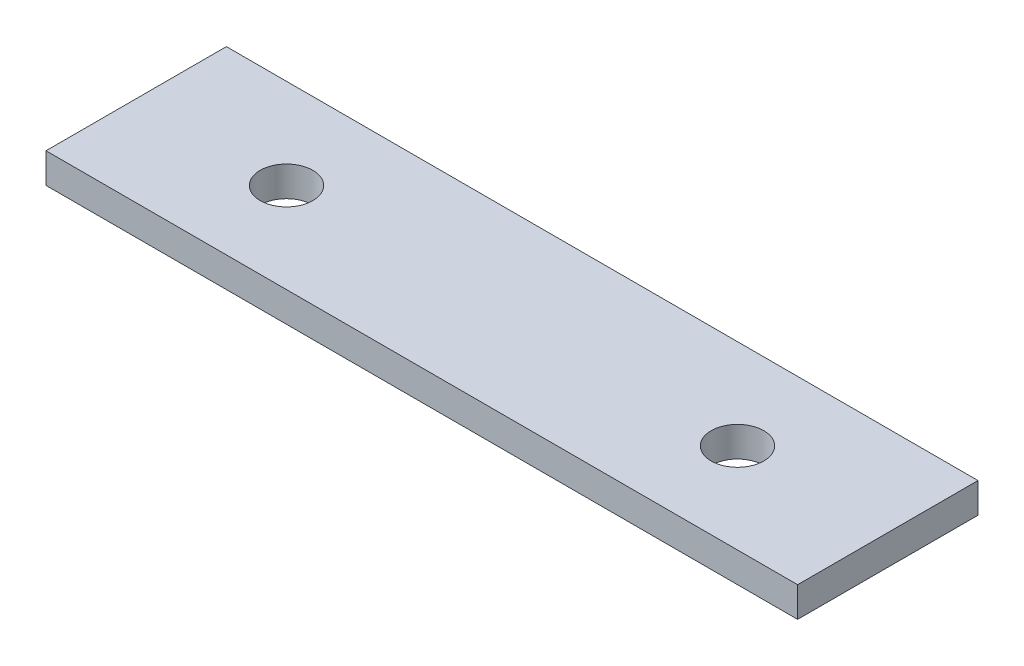
ISO-10303-21;
HEADER;
FILE_DESCRIPTION(('STEP AP214'),'2;1');
FILE_NAME('part.step','',(''),(''),'','','');
FILE_SCHEMA(('AUTOMOTIVE_DESIGN { 1 0 10303 214 1 1 1 1 }'));
ENDSEC;
DATA;
#1=APPLICATION_CONTEXT('core data for automotive mechanical design processes');
#2=APPLICATION_PROTOCOL_DEFINITION('international standard','automotive_design',2000,#1);
#3=PRODUCT_CONTEXT('',#1,'mechanical');
#4=PRODUCT('Part','Part','',(#3));
#5=PRODUCT_RELATED_PRODUCT_CATEGORY('part','',(#4));
#6=PRODUCT_DEFINITION_FORMATION('','',#4);
#7=PRODUCT_DEFINITION_CONTEXT('part definition',#1,'design');
#8=PRODUCT_DEFINITION('design','',#6,#7);
#9=PRODUCT_DEFINITION_SHAPE('','',#8);
#10=(LENGTH_UNIT() NAMED_UNIT(*) SI_UNIT(.MILLI.,.METRE.));
#11=(NAMED_UNIT(*) PLANE_ANGLE_UNIT() SI_UNIT($,.RADIAN.));
#12=(NAMED_UNIT(*) SI_UNIT($,.STERADIAN.) SOLID_ANGLE_UNIT());
#13=UNCERTAINTY_MEASURE_WITH_UNIT(LENGTH_MEASURE(1.E-05),#10,'distance_accuracy_value','');
#14=(GEOMETRIC_REPRESENTATION_CONTEXT(3) GLOBAL_UNCERTAINTY_ASSIGNED_CONTEXT((#13)) GLOBAL_UNIT_ASSIGNED_CONTEXT((#10,
#11,#12)) REPRESENTATION_CONTEXT('',''));
#15=CARTESIAN_POINT('',(0.,0.,0.));
#16=DIRECTION('',(0.,0.,1.));
#17=DIRECTION('',(1.,0.,0.));
#18=AXIS2_PLACEMENT_3D('',#15,#16,#17);
#19=CARTESIAN_POINT('',(0.,2.,0.));
#20=DIRECTION('',(0.,-1.,0.));
#21=DIRECTION('',(0.,0.,-1.));
#22=AXIS2_PLACEMENT_3D('',#19,#20,#21);
#23=PLANE('',#22);
#24=DIRECTION('',(0.,0.,1.));
#25=VECTOR('',#24,1.);
#26=CARTESIAN_POINT('',(-25.,2.,-6.));
#27=LINE('',#26,#25);
#28=CARTESIAN_POINT('',(-25.,2.,-6.));
#29=VERTEX_POINT('',#28);
#30=CARTESIAN_POINT('',(-25.,2.,6.));
#31=VERTEX_POINT('',#30);
#32=EDGE_CURVE('E89',#29,#31,#27,.T.);
#33=ORIENTED_EDGE('',*,*,#32,.T.);
#34=DIRECTION('',(1.,0.,0.));
#35=VECTOR('',#34,1.);
#36=CARTESIAN_POINT('',(25.,2.,6.));
#37=LINE('',#36,#35);
#38=CARTESIAN_POINT('',(25.,2.,6.));
#39=VERTEX_POINT('',#38);
#40=EDGE_CURVE('E84',#31,#39,#37,.T.);
#41=ORIENTED_EDGE('',*,*,#40,.T.);
#42=DIRECTION('',(0.,0.,-1.));
#43=VECTOR('',#42,1.);
#44=CARTESIAN_POINT('',(25.,2.,-6.));
#45=LINE('',#44,#43);
#46=CARTESIAN_POINT('',(25.,2.,-6.));
#47=VERTEX_POINT('',#46);
#48=EDGE_CURVE('E87',#39,#47,#45,.T.);
#49=ORIENTED_EDGE('',*,*,#48,.T.);
#50=DIRECTION('',(-1.,0.,0.));
#51=VECTOR('',#50,1.);
#52=CARTESIAN_POINT('',(25.,2.,-6.));
#53=LINE('',#52,#51);
#54=EDGE_CURVE('E54',#47,#29,#53,.T.);
#55=ORIENTED_EDGE('',*,*,#54,.T.);
#56=EDGE_LOOP('',(#33,#41,#49,#55));
#57=FACE_BOUND('',#56,.T.);
#58=CARTESIAN_POINT('',(-15.,2.,0.));
#59=DIRECTION('',(0.,1.,0.));
#60=DIRECTION('',(0.,0.,1.));
#61=AXIS2_PLACEMENT_3D('',#58,#59,#60);
#62=CIRCLE('',#61,1.75);
#63=CARTESIAN_POINT('',(-15.,2.,1.75));
#64=VERTEX_POINT('',#63);
#65=EDGE_CURVE('E104',#64,#64,#62,.T.);
#66=ORIENTED_EDGE('',*,*,#65,.F.);
#67=EDGE_LOOP('',(#66));
#68=FACE_BOUND('',#67,.T.);
#69=CARTESIAN_POINT('',(15.,2.,0.));
#70=DIRECTION('',(0.,1.,0.));
#71=DIRECTION('',(0.,0.,1.));
#72=AXIS2_PLACEMENT_3D('',#69,#70,#71);
#73=CIRCLE('',#72,1.75);
#74=CARTESIAN_POINT('',(15.,2.,1.75));
#75=VERTEX_POINT('',#74);
#76=EDGE_CURVE('E119',#75,#75,#73,.T.);
#77=ORIENTED_EDGE('',*,*,#76,.F.);
#78=EDGE_LOOP('',(#77));
#79=FACE_BOUND('',#78,.T.);
#80=ADVANCED_FACE('F37',(#57,#68,#79),#23,.F.);
#81=CARTESIAN_POINT('',(0.,0.,0.));
#82=DIRECTION('',(0.,-1.,0.));
#83=DIRECTION('',(0.,0.,-1.));
#84=AXIS2_PLACEMENT_3D('',#81,#82,#83);
#85=PLANE('',#84);
#86=CARTESIAN_POINT('',(-15.,0.,0.));
#87=DIRECTION('',(0.,1.,0.));
#88=DIRECTION('',(0.,0.,1.));
#89=AXIS2_PLACEMENT_3D('',#86,#87,#88);
#90=CIRCLE('',#89,1.75);
#91=CARTESIAN_POINT('',(-15.,0.,1.75));
#92=VERTEX_POINT('',#91);
#93=EDGE_CURVE('E116',#92,#92,#90,.T.);
#94=ORIENTED_EDGE('',*,*,#93,.T.);
#95=EDGE_LOOP('',(#94));
#96=FACE_BOUND('',#95,.T.);
#97=DIRECTION('',(0.,0.,1.));
#98=VECTOR('',#97,1.);
#99=CARTESIAN_POINT('',(-25.,0.,-6.));
#100=LINE('',#99,#98);
#101=CARTESIAN_POINT('',(-25.,0.,-6.));
#102=VERTEX_POINT('',#101);
#103=CARTESIAN_POINT('',(-25.,0.,6.));
#104=VERTEX_POINT('',#103);
#105=EDGE_CURVE('E101',#102,#104,#100,.T.);
#106=ORIENTED_EDGE('',*,*,#105,.F.);
#107=DIRECTION('',(-1.,0.,0.));
#108=VECTOR('',#107,1.);
#109=CARTESIAN_POINT('',(25.,0.,-6.));
#110=LINE('',#109,#108);
#111=CARTESIAN_POINT('',(25.,0.,-6.));
#112=VERTEX_POINT('',#111);
#113=EDGE_CURVE('E77',#112,#102,#110,.T.);
#114=ORIENTED_EDGE('',*,*,#113,.F.);
#115=DIRECTION('',(0.,0.,-1.));
#116=VECTOR('',#115,1.);
#117=CARTESIAN_POINT('',(25.,0.,-6.));
#118=LINE('',#117,#116);
#119=CARTESIAN_POINT('',(25.,0.,6.));
#120=VERTEX_POINT('',#119);
#121=EDGE_CURVE('E71',#120,#112,#118,.T.);
#122=ORIENTED_EDGE('',*,*,#121,.F.);
#123=DIRECTION('',(1.,0.,0.));
#124=VECTOR('',#123,1.);
#125=CARTESIAN_POINT('',(25.,0.,6.));
#126=LINE('',#125,#124);
#127=EDGE_CURVE('E93',#104,#120,#126,.T.);
#128=ORIENTED_EDGE('',*,*,#127,.F.);
#129=EDGE_LOOP('',(#106,#114,#122,#128));
#130=FACE_BOUND('',#129,.T.);
#131=CARTESIAN_POINT('',(15.,0.,0.));
#132=DIRECTION('',(0.,1.,0.));
#133=DIRECTION('',(0.,0.,1.));
#134=AXIS2_PLACEMENT_3D('',#131,#132,#133);
#135=CIRCLE('',#134,1.75);
#136=CARTESIAN_POINT('',(15.,0.,1.75));
#137=VERTEX_POINT('',#136);
#138=EDGE_CURVE('E122',#137,#137,#135,.T.);
#139=ORIENTED_EDGE('',*,*,#138,.T.);
#140=EDGE_LOOP('',(#139));
#141=FACE_BOUND('',#140,.T.);
#142=ADVANCED_FACE('F112',(#96,#130,#141),#85,.T.);
#143=CARTESIAN_POINT('',(-25.,2.,-6.));
#144=DIRECTION('',(1.,0.,0.));
#145=DIRECTION('',(0.,0.,-1.));
#146=AXIS2_PLACEMENT_3D('',#143,#144,#145);
#147=PLANE('',#146);
#148=ORIENTED_EDGE('',*,*,#105,.T.);
#149=DIRECTION('',(0.,-1.,0.));
#150=VECTOR('',#149,1.);
#151=CARTESIAN_POINT('',(-25.,2.,6.));
#152=LINE('',#151,#150);
#153=EDGE_CURVE('E11',#31,#104,#152,.T.);
#154=ORIENTED_EDGE('',*,*,#153,.F.);
#155=ORIENTED_EDGE('',*,*,#32,.F.);
#156=DIRECTION('',(0.,-1.,0.));
#157=VECTOR('',#156,1.);
#158=CARTESIAN_POINT('',(-25.,2.,-6.));
#159=LINE('',#158,#157);
#160=EDGE_CURVE('E97',#29,#102,#159,.T.);
#161=ORIENTED_EDGE('',*,*,#160,.T.);
#162=EDGE_LOOP('',(#148,#154,#155,#161));
#163=FACE_BOUND('',#162,.T.);
#164=ADVANCED_FACE('F39',(#163),#147,.F.);
#165=CARTESIAN_POINT('',(25.,2.,6.));
#166=DIRECTION('',(0.,0.,-1.));
#167=DIRECTION('',(-1.,0.,0.));
#168=AXIS2_PLACEMENT_3D('',#165,#166,#167);
#169=PLANE('',#168);
#170=ORIENTED_EDGE('',*,*,#127,.T.);
#171=DIRECTION('',(0.,-1.,0.));
#172=VECTOR('',#171,1.);
#173=CARTESIAN_POINT('',(25.,2.,6.));
#174=LINE('',#173,#172);
#175=EDGE_CURVE('E46',#39,#120,#174,.T.);
#176=ORIENTED_EDGE('',*,*,#175,.F.);
#177=ORIENTED_EDGE('',*,*,#40,.F.);
#178=ORIENTED_EDGE('',*,*,#153,.T.);
#179=EDGE_LOOP('',(#170,#176,#177,#178));
#180=FACE_BOUND('',#179,.T.);
#181=ADVANCED_FACE('F92',(#180),#169,.F.);
#182=CARTESIAN_POINT('',(25.,2.,-6.));
#183=DIRECTION('',(-1.,0.,0.));
#184=DIRECTION('',(0.,0.,1.));
#185=AXIS2_PLACEMENT_3D('',#182,#183,#184);
#186=PLANE('',#185);
#187=ORIENTED_EDGE('',*,*,#121,.T.);
#188=DIRECTION('',(0.,-1.,0.));
#189=VECTOR('',#188,1.);
#190=CARTESIAN_POINT('',(25.,2.,-6.));
#191=LINE('',#190,#189);
#192=EDGE_CURVE('E94',#47,#112,#191,.T.);
#193=ORIENTED_EDGE('',*,*,#192,.F.);
#194=ORIENTED_EDGE('',*,*,#48,.F.);
#195=ORIENTED_EDGE('',*,*,#175,.T.);
#196=EDGE_LOOP('',(#187,#193,#194,#195));
#197=FACE_BOUND('',#196,.T.);
#198=ADVANCED_FACE('F95',(#197),#186,.F.);
#199=CARTESIAN_POINT('',(25.,2.,-6.));
#200=DIRECTION('',(0.,0.,1.));
#201=DIRECTION('',(1.,0.,0.));
#202=AXIS2_PLACEMENT_3D('',#199,#200,#201);
#203=PLANE('',#202);
#204=ORIENTED_EDGE('',*,*,#113,.T.);
#205=ORIENTED_EDGE('',*,*,#160,.F.);
#206=ORIENTED_EDGE('',*,*,#54,.F.);
#207=ORIENTED_EDGE('',*,*,#192,.T.);
#208=EDGE_LOOP('',(#204,#205,#206,#207));
#209=FACE_BOUND('',#208,.T.);
#210=ADVANCED_FACE('F109',(#209),#203,.F.);
#211=CARTESIAN_POINT('',(-15.,2.,0.));
#212=DIRECTION('',(0.,-1.,0.));
#213=DIRECTION('',(0.,0.,-1.));
#214=AXIS2_PLACEMENT_3D('',#211,#212,#213);
#215=CYLINDRICAL_SURFACE('',#214,1.75);
#216=ORIENTED_EDGE('',*,*,#65,.T.);
#217=EDGE_LOOP('',(#216));
#218=FACE_BOUND('',#217,.T.);
#219=ORIENTED_EDGE('',*,*,#93,.F.);
#220=EDGE_LOOP('',(#219));
#221=FACE_BOUND('',#220,.T.);
#222=ADVANCED_FACE('F139',(#218,#221),#215,.F.);
#223=CARTESIAN_POINT('',(15.,2.,0.));
#224=DIRECTION('',(0.,-1.,0.));
#225=DIRECTION('',(0.,0.,-1.));
#226=AXIS2_PLACEMENT_3D('',#223,#224,#225);
#227=CYLINDRICAL_SURFACE('',#226,1.75);
#228=ORIENTED_EDGE('',*,*,#76,.T.);
#229=EDGE_LOOP('',(#228));
#230=FACE_BOUND('',#229,.T.);
#231=ORIENTED_EDGE('',*,*,#138,.F.);
#232=EDGE_LOOP('',(#231));
#233=FACE_BOUND('',#232,.T.);
#234=ADVANCED_FACE('F128',(#230,#233),#227,.F.);
#235=CLOSED_SHELL('',(#80,#142,#164,#181,#198,#210,#222,#234));
#236=MANIFOLD_SOLID_BREP('B2',#235);
#237=ADVANCED_BREP_SHAPE_REPRESENTATION('',(#18,#236),#14);
#238=SHAPE_DEFINITION_REPRESENTATION(#9,#237);
ENDSEC;
END-ISO-10303-21;
